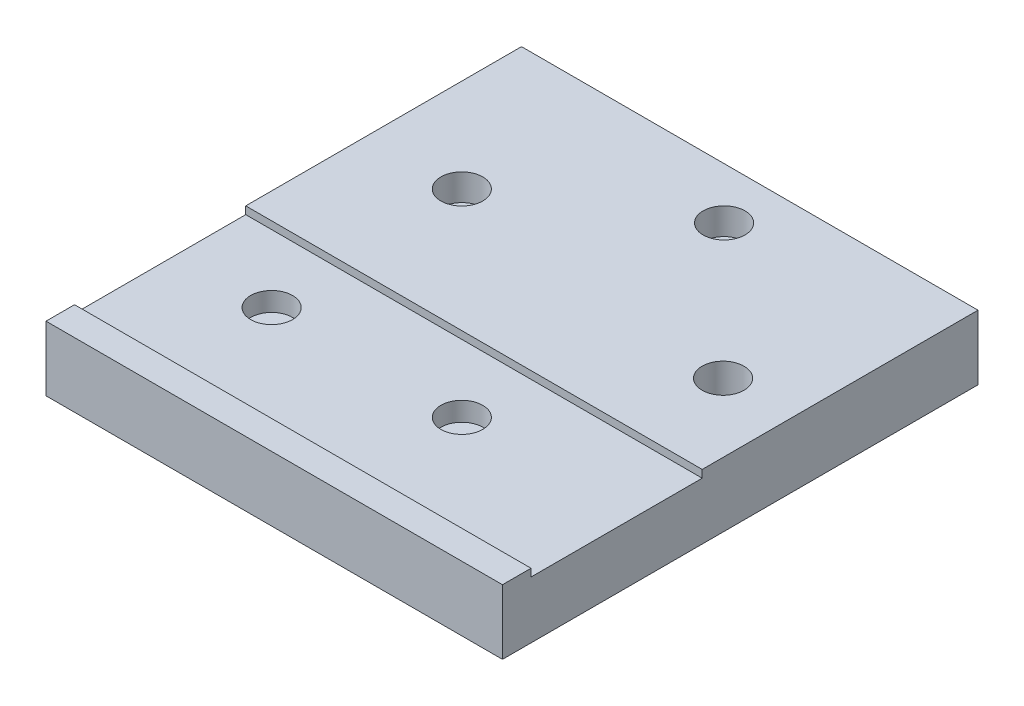
ISO-10303-21;
HEADER;
FILE_DESCRIPTION(('STEP AP214'),'2;1');
FILE_NAME('part.step','',(''),(''),'','','');
FILE_SCHEMA(('AUTOMOTIVE_DESIGN { 1 0 10303 214 1 1 1 1 }'));
ENDSEC;
DATA;
#1=APPLICATION_CONTEXT('core data for automotive mechanical design processes');
#2=APPLICATION_PROTOCOL_DEFINITION('international standard','automotive_design',2000,#1);
#3=PRODUCT_CONTEXT('',#1,'mechanical');
#4=PRODUCT('Part','Part','',(#3));
#5=PRODUCT_RELATED_PRODUCT_CATEGORY('part','',(#4));
#6=PRODUCT_DEFINITION_FORMATION('','',#4);
#7=PRODUCT_DEFINITION_CONTEXT('part definition',#1,'design');
#8=PRODUCT_DEFINITION('design','',#6,#7);
#9=PRODUCT_DEFINITION_SHAPE('','',#8);
#10=(LENGTH_UNIT() NAMED_UNIT(*) SI_UNIT(.MILLI.,.METRE.));
#11=(NAMED_UNIT(*) PLANE_ANGLE_UNIT() SI_UNIT($,.RADIAN.));
#12=(NAMED_UNIT(*) SI_UNIT($,.STERADIAN.) SOLID_ANGLE_UNIT());
#13=UNCERTAINTY_MEASURE_WITH_UNIT(LENGTH_MEASURE(1.E-05),#10,'distance_accuracy_value','');
#14=(GEOMETRIC_REPRESENTATION_CONTEXT(3) GLOBAL_UNCERTAINTY_ASSIGNED_CONTEXT((#13)) GLOBAL_UNIT_ASSIGNED_CONTEXT((#10,
#11,#12)) REPRESENTATION_CONTEXT('',''));
#15=CARTESIAN_POINT('',(0.,0.,0.));
#16=DIRECTION('',(0.,0.,1.));
#17=DIRECTION('',(1.,0.,0.));
#18=AXIS2_PLACEMENT_3D('',#15,#16,#17);
#19=CARTESIAN_POINT('',(-60.,5.,27.5));
#20=DIRECTION('',(0.,0.,-1.));
#21=DIRECTION('',(-1.,0.,0.));
#22=AXIS2_PLACEMENT_3D('',#19,#20,#21);
#23=PLANE('',#22);
#24=DIRECTION('',(1.,0.,0.));
#25=VECTOR('',#24,1.);
#26=CARTESIAN_POINT('',(-250.,7.00000000000002,27.5));
#27=LINE('',#26,#25);
#28=CARTESIAN_POINT('',(-250.,7.00000000000002,27.5));
#29=VERTEX_POINT('',#28);
#30=CARTESIAN_POINT('',(-130.,7.00000000000002,27.5));
#31=VERTEX_POINT('',#30);
#32=EDGE_CURVE('E60',#29,#31,#27,.T.);
#33=ORIENTED_EDGE('',*,*,#32,.F.);
#34=DIRECTION('',(0.,1.,0.));
#35=VECTOR('',#34,1.);
#36=CARTESIAN_POINT('',(-250.,25.,27.5));
#37=LINE('',#36,#35);
#38=CARTESIAN_POINT('',(-250.,-9.99999999999999,27.5));
#39=VERTEX_POINT('',#38);
#40=EDGE_CURVE('E114',#39,#29,#37,.T.);
#41=ORIENTED_EDGE('',*,*,#40,.F.);
#42=DIRECTION('',(-1.,0.,0.));
#43=VECTOR('',#42,1.);
#44=CARTESIAN_POINT('',(-130.,-9.99999999999999,27.5));
#45=LINE('',#44,#43);
#46=CARTESIAN_POINT('',(-130.,-9.99999999999999,27.5));
#47=VERTEX_POINT('',#46);
#48=EDGE_CURVE('E180',#47,#39,#45,.T.);
#49=ORIENTED_EDGE('',*,*,#48,.F.);
#50=DIRECTION('',(0.,-1.,0.));
#51=VECTOR('',#50,1.);
#52=CARTESIAN_POINT('',(-130.,25.,27.5));
#53=LINE('',#52,#51);
#54=EDGE_CURVE('E116',#31,#47,#53,.T.);
#55=ORIENTED_EDGE('',*,*,#54,.F.);
#56=EDGE_LOOP('',(#33,#41,#49,#55));
#57=FACE_BOUND('',#56,.T.);
#58=ADVANCED_FACE('F38',(#57),#23,.F.);
#59=CARTESIAN_POINT('',(-60.,25.,20.));
#60=DIRECTION('',(0.,0.,1.));
#61=DIRECTION('',(1.,0.,0.));
#62=AXIS2_PLACEMENT_3D('',#59,#60,#61);
#63=PLANE('',#62);
#64=DIRECTION('',(-1.,0.,0.));
#65=VECTOR('',#64,1.);
#66=CARTESIAN_POINT('',(-60.,7.00000000000002,20.));
#67=LINE('',#66,#65);
#68=CARTESIAN_POINT('',(-130.,7.00000000000002,20.));
#69=VERTEX_POINT('',#68);
#70=CARTESIAN_POINT('',(-250.,7.00000000000002,20.));
#71=VERTEX_POINT('',#70);
#72=EDGE_CURVE('E103',#69,#71,#67,.T.);
#73=ORIENTED_EDGE('',*,*,#72,.F.);
#74=DIRECTION('',(0.,1.,0.));
#75=VECTOR('',#74,1.);
#76=CARTESIAN_POINT('',(-130.,25.,20.));
#77=LINE('',#76,#75);
#78=CARTESIAN_POINT('',(-130.,5.,20.));
#79=VERTEX_POINT('',#78);
#80=EDGE_CURVE('E156',#79,#69,#77,.T.);
#81=ORIENTED_EDGE('',*,*,#80,.F.);
#82=DIRECTION('',(-1.,0.,0.));
#83=VECTOR('',#82,1.);
#84=CARTESIAN_POINT('',(-60.,5.,20.));
#85=LINE('',#84,#83);
#86=CARTESIAN_POINT('',(-250.,5.,20.));
#87=VERTEX_POINT('',#86);
#88=EDGE_CURVE('E46',#79,#87,#85,.T.);
#89=ORIENTED_EDGE('',*,*,#88,.T.);
#90=DIRECTION('',(0.,-1.,0.));
#91=VECTOR('',#90,1.);
#92=CARTESIAN_POINT('',(-250.,5.,20.));
#93=LINE('',#92,#91);
#94=EDGE_CURVE('E126',#71,#87,#93,.T.);
#95=ORIENTED_EDGE('',*,*,#94,.F.);
#96=EDGE_LOOP('',(#73,#81,#89,#95));
#97=FACE_BOUND('',#96,.T.);
#98=ADVANCED_FACE('F154',(#97),#63,.F.);
#99=CARTESIAN_POINT('',(60.,25.,-25.));
#100=DIRECTION('',(0.,0.,-1.));
#101=DIRECTION('',(-1.,0.,0.));
#102=AXIS2_PLACEMENT_3D('',#99,#100,#101);
#103=PLANE('',#102);
#104=DIRECTION('',(1.,0.,0.));
#105=VECTOR('',#104,1.);
#106=CARTESIAN_POINT('',(60.,7.00000000000002,-25.));
#107=LINE('',#106,#105);
#108=CARTESIAN_POINT('',(-250.,7.00000000000002,-25.));
#109=VERTEX_POINT('',#108);
#110=CARTESIAN_POINT('',(-130.,7.00000000000002,-25.));
#111=VERTEX_POINT('',#110);
#112=EDGE_CURVE('E53',#109,#111,#107,.T.);
#113=ORIENTED_EDGE('',*,*,#112,.F.);
#114=DIRECTION('',(0.,1.,0.));
#115=VECTOR('',#114,1.);
#116=CARTESIAN_POINT('',(-250.,25.,-25.));
#117=LINE('',#116,#115);
#118=CARTESIAN_POINT('',(-250.,5.,-25.));
#119=VERTEX_POINT('',#118);
#120=EDGE_CURVE('E141',#119,#109,#117,.T.);
#121=ORIENTED_EDGE('',*,*,#120,.F.);
#122=DIRECTION('',(1.,0.,0.));
#123=VECTOR('',#122,1.);
#124=CARTESIAN_POINT('',(60.,5.,-25.));
#125=LINE('',#124,#123);
#126=CARTESIAN_POINT('',(-130.,5.,-25.));
#127=VERTEX_POINT('',#126);
#128=EDGE_CURVE('E145',#119,#127,#125,.T.);
#129=ORIENTED_EDGE('',*,*,#128,.T.);
#130=DIRECTION('',(0.,-1.,0.));
#131=VECTOR('',#130,1.);
#132=CARTESIAN_POINT('',(-130.,25.,-25.));
#133=LINE('',#132,#131);
#134=EDGE_CURVE('E164',#111,#127,#133,.T.);
#135=ORIENTED_EDGE('',*,*,#134,.F.);
#136=EDGE_LOOP('',(#113,#121,#129,#135));
#137=FACE_BOUND('',#136,.T.);
#138=ADVANCED_FACE('F162',(#137),#103,.F.);
#139=CARTESIAN_POINT('',(0.,0.,-97.5));
#140=DIRECTION('',(0.,0.,1.));
#141=DIRECTION('',(1.,0.,0.));
#142=AXIS2_PLACEMENT_3D('',#139,#140,#141);
#143=PLANE('',#142);
#144=DIRECTION('',(-1.,0.,0.));
#145=VECTOR('',#144,1.);
#146=CARTESIAN_POINT('',(-250.,7.00000000000002,-97.5));
#147=LINE('',#146,#145);
#148=CARTESIAN_POINT('',(-130.,7.00000000000002,-97.5));
#149=VERTEX_POINT('',#148);
#150=CARTESIAN_POINT('',(-250.,7.00000000000002,-97.5));
#151=VERTEX_POINT('',#150);
#152=EDGE_CURVE('E293',#149,#151,#147,.T.);
#153=ORIENTED_EDGE('',*,*,#152,.F.);
#154=DIRECTION('',(0.,1.,0.));
#155=VECTOR('',#154,1.);
#156=CARTESIAN_POINT('',(-130.,25.,-97.5));
#157=LINE('',#156,#155);
#158=CARTESIAN_POINT('',(-130.,-9.99999999999999,-97.5));
#159=VERTEX_POINT('',#158);
#160=EDGE_CURVE('E192',#159,#149,#157,.T.);
#161=ORIENTED_EDGE('',*,*,#160,.F.);
#162=DIRECTION('',(1.,0.,0.));
#163=VECTOR('',#162,1.);
#164=CARTESIAN_POINT('',(-130.,-9.99999999999999,-97.5));
#165=LINE('',#164,#163);
#166=CARTESIAN_POINT('',(-250.,-9.99999999999999,-97.5));
#167=VERTEX_POINT('',#166);
#168=EDGE_CURVE('E185',#167,#159,#165,.T.);
#169=ORIENTED_EDGE('',*,*,#168,.F.);
#170=DIRECTION('',(0.,1.,0.));
#171=VECTOR('',#170,1.);
#172=CARTESIAN_POINT('',(-250.,25.,-97.5));
#173=LINE('',#172,#171);
#174=EDGE_CURVE('E127',#167,#151,#173,.T.);
#175=ORIENTED_EDGE('',*,*,#174,.T.);
#176=EDGE_LOOP('',(#153,#161,#169,#175));
#177=FACE_BOUND('',#176,.T.);
#178=ADVANCED_FACE('F252',(#177),#143,.F.);
#179=CARTESIAN_POINT('',(-250.,0.,0.));
#180=DIRECTION('',(1.,0.,0.));
#181=DIRECTION('',(0.,0.,-1.));
#182=AXIS2_PLACEMENT_3D('',#179,#180,#181);
#183=PLANE('',#182);
#184=DIRECTION('',(0.,0.,1.));
#185=VECTOR('',#184,1.);
#186=CARTESIAN_POINT('',(-250.,7.00000000000002,-97.5));
#187=LINE('',#186,#185);
#188=EDGE_CURVE('E108',#151,#109,#187,.T.);
#189=ORIENTED_EDGE('',*,*,#188,.F.);
#190=ORIENTED_EDGE('',*,*,#174,.F.);
#191=DIRECTION('',(0.,0.,-1.));
#192=VECTOR('',#191,1.);
#193=CARTESIAN_POINT('',(-250.,-9.99999999999999,27.5));
#194=LINE('',#193,#192);
#195=EDGE_CURVE('E124',#39,#167,#194,.T.);
#196=ORIENTED_EDGE('',*,*,#195,.F.);
#197=ORIENTED_EDGE('',*,*,#40,.T.);
#198=EDGE_CURVE('E100',#71,#29,#187,.T.);
#199=ORIENTED_EDGE('',*,*,#198,.F.);
#200=ORIENTED_EDGE('',*,*,#94,.T.);
#201=DIRECTION('',(0.,0.,-1.));
#202=VECTOR('',#201,1.);
#203=CARTESIAN_POINT('',(-250.,5.,-25.));
#204=LINE('',#203,#202);
#205=EDGE_CURVE('E131',#87,#119,#204,.T.);
#206=ORIENTED_EDGE('',*,*,#205,.T.);
#207=ORIENTED_EDGE('',*,*,#120,.T.);
#208=EDGE_LOOP('',(#189,#190,#196,#197,#199,#200,#206,#207));
#209=FACE_BOUND('',#208,.T.);
#210=ADVANCED_FACE('F122',(#209),#183,.F.);
#211=CARTESIAN_POINT('',(-130.,0.,0.));
#212=DIRECTION('',(1.,0.,0.));
#213=DIRECTION('',(0.,0.,-1.));
#214=AXIS2_PLACEMENT_3D('',#211,#212,#213);
#215=PLANE('',#214);
#216=ORIENTED_EDGE('',*,*,#160,.T.);
#217=DIRECTION('',(0.,0.,1.));
#218=VECTOR('',#217,1.);
#219=CARTESIAN_POINT('',(-130.,7.00000000000002,0.));
#220=LINE('',#219,#218);
#221=EDGE_CURVE('E11',#149,#111,#220,.T.);
#222=ORIENTED_EDGE('',*,*,#221,.T.);
#223=ORIENTED_EDGE('',*,*,#134,.T.);
#224=DIRECTION('',(0.,0.,1.));
#225=VECTOR('',#224,1.);
#226=CARTESIAN_POINT('',(-130.,5.,0.));
#227=LINE('',#226,#225);
#228=EDGE_CURVE('E199',#127,#79,#227,.T.);
#229=ORIENTED_EDGE('',*,*,#228,.T.);
#230=ORIENTED_EDGE('',*,*,#80,.T.);
#231=DIRECTION('',(0.,0.,-1.));
#232=VECTOR('',#231,1.);
#233=CARTESIAN_POINT('',(-130.,7.00000000000002,-97.5));
#234=LINE('',#233,#232);
#235=EDGE_CURVE('E118',#31,#69,#234,.T.);
#236=ORIENTED_EDGE('',*,*,#235,.F.);
#237=ORIENTED_EDGE('',*,*,#54,.T.);
#238=DIRECTION('',(0.,0.,1.));
#239=VECTOR('',#238,1.);
#240=CARTESIAN_POINT('',(-130.,-9.99999999999999,27.5));
#241=LINE('',#240,#239);
#242=EDGE_CURVE('E170',#159,#47,#241,.T.);
#243=ORIENTED_EDGE('',*,*,#242,.F.);
#244=EDGE_LOOP('',(#216,#222,#223,#229,#230,#236,#237,#243));
#245=FACE_BOUND('',#244,.T.);
#246=ADVANCED_FACE('F256',(#245),#215,.T.);
#247=CARTESIAN_POINT('',(0.,5.,0.));
#248=DIRECTION('',(0.,-1.,0.));
#249=DIRECTION('',(0.,0.,-1.));
#250=AXIS2_PLACEMENT_3D('',#247,#248,#249);
#251=PLANE('',#250);
#252=CARTESIAN_POINT('',(-225.445279058098,5.,-7.25516146171794));
#253=DIRECTION('',(0.,-1.,0.));
#254=DIRECTION('',(0.,0.,-1.));
#255=AXIS2_PLACEMENT_3D('',#252,#253,#254);
#256=CIRCLE('',#255,5.50000000000002);
#257=CARTESIAN_POINT('',(-225.445279058098,5.,-12.755161461718));
#258=VERTEX_POINT('',#257);
#259=EDGE_CURVE('E204',#258,#258,#256,.T.);
#260=ORIENTED_EDGE('',*,*,#259,.T.);
#261=EDGE_LOOP('',(#260));
#262=FACE_BOUND('',#261,.T.);
#263=CARTESIAN_POINT('',(-175.445279058098,5.,-7.25516146171793));
#264=DIRECTION('',(0.,-1.,0.));
#265=DIRECTION('',(0.,0.,-1.));
#266=AXIS2_PLACEMENT_3D('',#263,#264,#265);
#267=CIRCLE('',#266,5.50000000000002);
#268=CARTESIAN_POINT('',(-175.445279058098,5.,-12.755161461718));
#269=VERTEX_POINT('',#268);
#270=EDGE_CURVE('E134',#269,#269,#267,.T.);
#271=ORIENTED_EDGE('',*,*,#270,.T.);
#272=EDGE_LOOP('',(#271));
#273=FACE_BOUND('',#272,.T.);
#274=ORIENTED_EDGE('',*,*,#228,.F.);
#275=ORIENTED_EDGE('',*,*,#128,.F.);
#276=ORIENTED_EDGE('',*,*,#205,.F.);
#277=ORIENTED_EDGE('',*,*,#88,.F.);
#278=EDGE_LOOP('',(#274,#275,#276,#277));
#279=FACE_BOUND('',#278,.T.);
#280=ADVANCED_FACE('F159',(#262,#273,#279),#251,.F.);
#281=CARTESIAN_POINT('',(-225.445279058098,153.,-7.25516146171794));
#282=DIRECTION('',(0.,-1.,0.));
#283=DIRECTION('',(0.,0.,-1.));
#284=AXIS2_PLACEMENT_3D('',#281,#282,#283);
#285=CYLINDRICAL_SURFACE('',#284,5.50000000000002);
#286=CARTESIAN_POINT('',(-225.445279058098,0.,-7.25516146171794));
#287=DIRECTION('',(0.,-1.,0.));
#288=DIRECTION('',(0.,0.,-1.));
#289=AXIS2_PLACEMENT_3D('',#286,#287,#288);
#290=CIRCLE('',#289,5.50000000000002);
#291=CARTESIAN_POINT('',(-225.445279058098,0.,-12.755161461718));
#292=VERTEX_POINT('',#291);
#293=EDGE_CURVE('E189',#292,#292,#290,.T.);
#294=ORIENTED_EDGE('',*,*,#293,.T.);
#295=EDGE_LOOP('',(#294));
#296=FACE_BOUND('',#295,.T.);
#297=ORIENTED_EDGE('',*,*,#259,.F.);
#298=EDGE_LOOP('',(#297));
#299=FACE_BOUND('',#298,.T.);
#300=ADVANCED_FACE('F229',(#296,#299),#285,.F.);
#301=CARTESIAN_POINT('',(-175.445279058098,153.,-7.25516146171793));
#302=DIRECTION('',(0.,-1.,0.));
#303=DIRECTION('',(0.,0.,-1.));
#304=AXIS2_PLACEMENT_3D('',#301,#302,#303);
#305=CYLINDRICAL_SURFACE('',#304,5.50000000000002);
#306=CARTESIAN_POINT('',(-175.445279058098,0.,-7.25516146171793));
#307=DIRECTION('',(0.,-1.,0.));
#308=DIRECTION('',(0.,0.,-1.));
#309=AXIS2_PLACEMENT_3D('',#306,#307,#308);
#310=CIRCLE('',#309,5.50000000000002);
#311=CARTESIAN_POINT('',(-175.445279058098,0.,-12.755161461718));
#312=VERTEX_POINT('',#311);
#313=EDGE_CURVE('E209',#312,#312,#310,.T.);
#314=ORIENTED_EDGE('',*,*,#313,.T.);
#315=EDGE_LOOP('',(#314));
#316=FACE_BOUND('',#315,.T.);
#317=ORIENTED_EDGE('',*,*,#270,.F.);
#318=EDGE_LOOP('',(#317));
#319=FACE_BOUND('',#318,.T.);
#320=ADVANCED_FACE('F226',(#316,#319),#305,.F.);
#321=CARTESIAN_POINT('',(0.,0.,0.));
#322=DIRECTION('',(0.,1.,0.));
#323=DIRECTION('',(0.,0.,1.));
#324=AXIS2_PLACEMENT_3D('',#321,#322,#323);
#325=PLANE('',#324);
#326=ORIENTED_EDGE('',*,*,#293,.F.);
#327=EDGE_LOOP('',(#326));
#328=FACE_BOUND('',#327,.T.);
#329=ADVANCED_FACE('F228',(#328),#325,.T.);
#330=ORIENTED_EDGE('',*,*,#313,.F.);
#331=EDGE_LOOP('',(#330));
#332=FACE_BOUND('',#331,.T.);
#333=ADVANCED_FACE('F236',(#332),#325,.T.);
#334=CARTESIAN_POINT('',(0.,-9.99999999999999,0.));
#335=DIRECTION('',(0.,1.,0.));
#336=DIRECTION('',(0.,0.,1.));
#337=AXIS2_PLACEMENT_3D('',#334,#335,#336);
#338=PLANE('',#337);
#339=CARTESIAN_POINT('',(-148.018210700188,-9.99999999999999,-48.5));
#340=DIRECTION('',(0.,1.,0.));
#341=DIRECTION('',(0.,0.,1.));
#342=AXIS2_PLACEMENT_3D('',#339,#340,#341);
#343=CIRCLE('',#342,5.50000000000002);
#344=CARTESIAN_POINT('',(-148.018210700188,-9.99999999999999,-43.));
#345=VERTEX_POINT('',#344);
#346=EDGE_CURVE('E109',#345,#345,#343,.T.);
#347=ORIENTED_EDGE('',*,*,#346,.T.);
#348=EDGE_LOOP('',(#347));
#349=FACE_BOUND('',#348,.T.);
#350=ORIENTED_EDGE('',*,*,#242,.T.);
#351=ORIENTED_EDGE('',*,*,#48,.T.);
#352=ORIENTED_EDGE('',*,*,#195,.T.);
#353=ORIENTED_EDGE('',*,*,#168,.T.);
#354=EDGE_LOOP('',(#350,#351,#352,#353));
#355=FACE_BOUND('',#354,.T.);
#356=ADVANCED_FACE('F307',(#349,#355),#338,.F.);
#357=CARTESIAN_POINT('',(0.,7.00000000000002,0.));
#358=DIRECTION('',(0.,1.,0.));
#359=DIRECTION('',(0.,0.,1.));
#360=AXIS2_PLACEMENT_3D('',#357,#358,#359);
#361=PLANE('',#360);
#362=ORIENTED_EDGE('',*,*,#72,.T.);
#363=ORIENTED_EDGE('',*,*,#198,.T.);
#364=ORIENTED_EDGE('',*,*,#32,.T.);
#365=ORIENTED_EDGE('',*,*,#235,.T.);
#366=EDGE_LOOP('',(#362,#363,#364,#365));
#367=FACE_BOUND('',#366,.T.);
#368=ADVANCED_FACE('F101',(#367),#361,.T.);
#369=CARTESIAN_POINT('',(-183.240850763284,7.00000000000003,-83.9875418560589));
#370=DIRECTION('',(0.,1.,0.));
#371=DIRECTION('',(0.,0.,1.));
#372=AXIS2_PLACEMENT_3D('',#369,#370,#371);
#373=CIRCLE('',#372,5.50000000000002);
#374=CARTESIAN_POINT('',(-183.240850763284,7.00000000000003,-78.4875418560588));
#375=VERTEX_POINT('',#374);
#376=EDGE_CURVE('E166',#375,#375,#373,.F.);
#377=ORIENTED_EDGE('',*,*,#376,.T.);
#378=EDGE_LOOP('',(#377));
#379=FACE_BOUND('',#378,.T.);
#380=CARTESIAN_POINT('',(-148.018210700188,7.00000000000003,-48.5));
#381=DIRECTION('',(0.,1.,0.));
#382=DIRECTION('',(0.,0.,1.));
#383=AXIS2_PLACEMENT_3D('',#380,#381,#382);
#384=CIRCLE('',#383,5.50000000000002);
#385=CARTESIAN_POINT('',(-148.018210700188,7.00000000000003,-43.));
#386=VERTEX_POINT('',#385);
#387=EDGE_CURVE('E173',#386,#386,#384,.F.);
#388=ORIENTED_EDGE('',*,*,#387,.T.);
#389=EDGE_LOOP('',(#388));
#390=FACE_BOUND('',#389,.T.);
#391=CARTESIAN_POINT('',(-225.445279058098,7.00000000000003,-57.2551614617179));
#392=DIRECTION('',(0.,1.,0.));
#393=DIRECTION('',(0.,0.,1.));
#394=AXIS2_PLACEMENT_3D('',#391,#392,#393);
#395=CIRCLE('',#394,5.50000000000002);
#396=CARTESIAN_POINT('',(-225.445279058098,7.00000000000003,-51.7551614617179));
#397=VERTEX_POINT('',#396);
#398=EDGE_CURVE('E290',#397,#397,#395,.F.);
#399=ORIENTED_EDGE('',*,*,#398,.T.);
#400=EDGE_LOOP('',(#399));
#401=FACE_BOUND('',#400,.T.);
#402=ORIENTED_EDGE('',*,*,#112,.T.);
#403=ORIENTED_EDGE('',*,*,#221,.F.);
#404=ORIENTED_EDGE('',*,*,#152,.T.);
#405=ORIENTED_EDGE('',*,*,#188,.T.);
#406=EDGE_LOOP('',(#402,#403,#404,#405));
#407=FACE_BOUND('',#406,.T.);
#408=ADVANCED_FACE('F284',(#379,#390,#401,#407),#361,.T.);
#409=CARTESIAN_POINT('',(-225.445279058098,0.,-57.2551614617179));
#410=DIRECTION('',(0.,-1.,0.));
#411=DIRECTION('',(0.,0.,-1.));
#412=AXIS2_PLACEMENT_3D('',#409,#410,#411);
#413=CIRCLE('',#412,5.50000000000002);
#414=CARTESIAN_POINT('',(-225.445279058098,0.,-62.755161461718));
#415=VERTEX_POINT('',#414);
#416=EDGE_CURVE('E193',#415,#415,#413,.T.);
#417=ORIENTED_EDGE('',*,*,#416,.F.);
#418=EDGE_LOOP('',(#417));
#419=FACE_BOUND('',#418,.T.);
#420=ADVANCED_FACE('F239',(#419),#325,.T.);
#421=CARTESIAN_POINT('',(-225.445279058098,153.,-57.2551614617179));
#422=DIRECTION('',(0.,-1.,0.));
#423=DIRECTION('',(0.,0.,-1.));
#424=AXIS2_PLACEMENT_3D('',#421,#422,#423);
#425=CYLINDRICAL_SURFACE('',#424,5.50000000000002);
#426=ORIENTED_EDGE('',*,*,#416,.T.);
#427=EDGE_LOOP('',(#426));
#428=FACE_BOUND('',#427,.T.);
#429=ORIENTED_EDGE('',*,*,#398,.F.);
#430=EDGE_LOOP('',(#429));
#431=FACE_BOUND('',#430,.T.);
#432=ADVANCED_FACE('F273',(#428,#431),#425,.F.);
#433=CARTESIAN_POINT('',(-148.018210700188,153.,-48.5));
#434=DIRECTION('',(0.,-1.,0.));
#435=DIRECTION('',(0.,0.,-1.));
#436=AXIS2_PLACEMENT_3D('',#433,#434,#435);
#437=CYLINDRICAL_SURFACE('',#436,5.50000000000002);
#438=ORIENTED_EDGE('',*,*,#387,.F.);
#439=EDGE_LOOP('',(#438));
#440=FACE_BOUND('',#439,.T.);
#441=ORIENTED_EDGE('',*,*,#346,.F.);
#442=EDGE_LOOP('',(#441));
#443=FACE_BOUND('',#442,.T.);
#444=ADVANCED_FACE('F270',(#440,#443),#437,.F.);
#445=CARTESIAN_POINT('',(-183.240850763284,0.,-83.9875418560589));
#446=DIRECTION('',(0.,-1.,0.));
#447=DIRECTION('',(0.,0.,-1.));
#448=AXIS2_PLACEMENT_3D('',#445,#446,#447);
#449=CIRCLE('',#448,5.50000000000002);
#450=CARTESIAN_POINT('',(-183.240850763284,0.,-89.4875418560589));
#451=VERTEX_POINT('',#450);
#452=EDGE_CURVE('E205',#451,#451,#449,.T.);
#453=ORIENTED_EDGE('',*,*,#452,.F.);
#454=EDGE_LOOP('',(#453));
#455=FACE_BOUND('',#454,.T.);
#456=ADVANCED_FACE('F240',(#455),#325,.T.);
#457=CARTESIAN_POINT('',(-183.240850763284,153.,-83.9875418560589));
#458=DIRECTION('',(0.,-1.,0.));
#459=DIRECTION('',(0.,0.,-1.));
#460=AXIS2_PLACEMENT_3D('',#457,#458,#459);
#461=CYLINDRICAL_SURFACE('',#460,5.50000000000002);
#462=ORIENTED_EDGE('',*,*,#452,.T.);
#463=EDGE_LOOP('',(#462));
#464=FACE_BOUND('',#463,.T.);
#465=ORIENTED_EDGE('',*,*,#376,.F.);
#466=EDGE_LOOP('',(#465));
#467=FACE_BOUND('',#466,.T.);
#468=ADVANCED_FACE('F275',(#464,#467),#461,.F.);
#469=CLOSED_SHELL('',(#58,#98,#138,#178,#210,#246,#280,#300,#320,#329,#333,#356,#368,#408,#420,
#432,#444,#456,#468));
#470=MANIFOLD_SOLID_BREP('B2',#469);
#471=ADVANCED_BREP_SHAPE_REPRESENTATION('',(#18,#470),#14);
#472=SHAPE_DEFINITION_REPRESENTATION(#9,#471);
ENDSEC;
END-ISO-10303-21;
